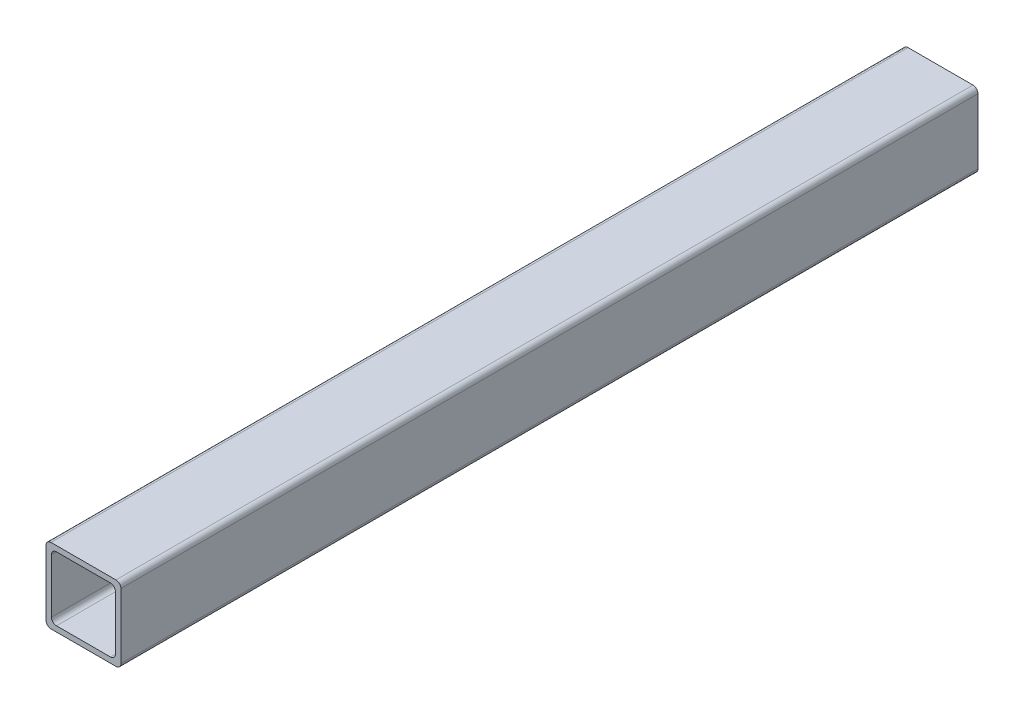
ISO-10303-21;
HEADER;
FILE_DESCRIPTION(('STEP AP214'),'2;1');
FILE_NAME('part.step','',(''),(''),'','','');
FILE_SCHEMA(('AUTOMOTIVE_DESIGN { 1 0 10303 214 1 1 1 1 }'));
ENDSEC;
DATA;
#1=APPLICATION_CONTEXT('core data for automotive mechanical design processes');
#2=APPLICATION_PROTOCOL_DEFINITION('international standard','automotive_design',2000,#1);
#3=PRODUCT_CONTEXT('',#1,'mechanical');
#4=PRODUCT('Part','Part','',(#3));
#5=PRODUCT_RELATED_PRODUCT_CATEGORY('part','',(#4));
#6=PRODUCT_DEFINITION_FORMATION('','',#4);
#7=PRODUCT_DEFINITION_CONTEXT('part definition',#1,'design');
#8=PRODUCT_DEFINITION('design','',#6,#7);
#9=PRODUCT_DEFINITION_SHAPE('','',#8);
#10=(LENGTH_UNIT() NAMED_UNIT(*) SI_UNIT(.MILLI.,.METRE.));
#11=(NAMED_UNIT(*) PLANE_ANGLE_UNIT() SI_UNIT($,.RADIAN.));
#12=(NAMED_UNIT(*) SI_UNIT($,.STERADIAN.) SOLID_ANGLE_UNIT());
#13=UNCERTAINTY_MEASURE_WITH_UNIT(LENGTH_MEASURE(1.E-05),#10,'distance_accuracy_value','');
#14=(GEOMETRIC_REPRESENTATION_CONTEXT(3) GLOBAL_UNCERTAINTY_ASSIGNED_CONTEXT((#13)) GLOBAL_UNIT_ASSIGNED_CONTEXT((#10,
#11,#12)) REPRESENTATION_CONTEXT('',''));
#15=CARTESIAN_POINT('',(0.,0.,0.));
#16=DIRECTION('',(0.,0.,1.));
#17=DIRECTION('',(1.,0.,0.));
#18=AXIS2_PLACEMENT_3D('',#15,#16,#17);
#19=CARTESIAN_POINT('',(2.54,-35.56,435.78));
#20=DIRECTION('',(0.,0.,1.));
#21=DIRECTION('',(1.,0.,0.));
#22=AXIS2_PLACEMENT_3D('',#19,#20,#21);
#23=PLANE('',#22);
#24=CARTESIAN_POINT('',(2.54,-35.56,435.78));
#25=DIRECTION('',(0.,0.,1.));
#26=DIRECTION('',(1.,0.,0.));
#27=AXIS2_PLACEMENT_3D('',#24,#25,#26);
#28=CIRCLE('',#27,2.54);
#29=CARTESIAN_POINT('',(0.,-35.56,435.78));
#30=VERTEX_POINT('',#29);
#31=CARTESIAN_POINT('',(2.54000000000002,-38.1,435.78));
#32=VERTEX_POINT('',#31);
#33=EDGE_CURVE('E212',#30,#32,#28,.T.);
#34=ORIENTED_EDGE('',*,*,#33,.T.);
#35=DIRECTION('',(1.,0.,0.));
#36=VECTOR('',#35,1.);
#37=CARTESIAN_POINT('',(2.54000000000002,-38.1,435.78));
#38=LINE('',#37,#36);
#39=CARTESIAN_POINT('',(35.56,-38.1,435.78));
#40=VERTEX_POINT('',#39);
#41=EDGE_CURVE('E215',#32,#40,#38,.T.);
#42=ORIENTED_EDGE('',*,*,#41,.T.);
#43=CARTESIAN_POINT('',(35.56,-35.56,435.78));
#44=DIRECTION('',(0.,0.,1.));
#45=DIRECTION('',(-1.,0.,0.));
#46=AXIS2_PLACEMENT_3D('',#43,#44,#45);
#47=CIRCLE('',#46,2.54);
#48=CARTESIAN_POINT('',(38.1,-35.56,435.78));
#49=VERTEX_POINT('',#48);
#50=EDGE_CURVE('E218',#40,#49,#47,.T.);
#51=ORIENTED_EDGE('',*,*,#50,.T.);
#52=DIRECTION('',(0.,1.,0.));
#53=VECTOR('',#52,1.);
#54=CARTESIAN_POINT('',(38.1,-2.54000000000002,435.78));
#55=LINE('',#54,#53);
#56=CARTESIAN_POINT('',(38.1,-2.54000000000002,435.78));
#57=VERTEX_POINT('',#56);
#58=EDGE_CURVE('E220',#49,#57,#55,.T.);
#59=ORIENTED_EDGE('',*,*,#58,.T.);
#60=CARTESIAN_POINT('',(35.56,-2.54,435.78));
#61=DIRECTION('',(0.,0.,1.));
#62=DIRECTION('',(1.,0.,0.));
#63=AXIS2_PLACEMENT_3D('',#60,#61,#62);
#64=CIRCLE('',#63,2.54);
#65=CARTESIAN_POINT('',(35.56,0.,435.78));
#66=VERTEX_POINT('',#65);
#67=EDGE_CURVE('E222',#57,#66,#64,.T.);
#68=ORIENTED_EDGE('',*,*,#67,.T.);
#69=DIRECTION('',(-1.,0.,0.));
#70=VECTOR('',#69,1.);
#71=CARTESIAN_POINT('',(2.54000000000002,0.,435.78));
#72=LINE('',#71,#70);
#73=CARTESIAN_POINT('',(2.54000000000002,0.,435.78));
#74=VERTEX_POINT('',#73);
#75=EDGE_CURVE('E224',#66,#74,#72,.T.);
#76=ORIENTED_EDGE('',*,*,#75,.T.);
#77=CARTESIAN_POINT('',(2.54,-2.54,435.78));
#78=DIRECTION('',(0.,0.,1.));
#79=DIRECTION('',(-1.,0.,0.));
#80=AXIS2_PLACEMENT_3D('',#77,#78,#79);
#81=CIRCLE('',#80,2.54);
#82=CARTESIAN_POINT('',(0.,-2.54000000000002,435.78));
#83=VERTEX_POINT('',#82);
#84=EDGE_CURVE('E226',#74,#83,#81,.T.);
#85=ORIENTED_EDGE('',*,*,#84,.T.);
#86=DIRECTION('',(0.,-1.,0.));
#87=VECTOR('',#86,1.);
#88=CARTESIAN_POINT('',(0.,-2.54000000000002,435.78));
#89=LINE('',#88,#87);
#90=EDGE_CURVE('E228',#83,#30,#89,.T.);
#91=ORIENTED_EDGE('',*,*,#90,.T.);
#92=EDGE_LOOP('',(#34,#42,#51,#59,#68,#76,#85,#91));
#93=FACE_BOUND('',#92,.T.);
#94=DIRECTION('',(1.,0.,0.));
#95=VECTOR('',#94,1.);
#96=CARTESIAN_POINT('',(5.30860000000002,-35.3314,435.78));
#97=LINE('',#96,#95);
#98=CARTESIAN_POINT('',(5.30860000000002,-35.3314,435.78));
#99=VERTEX_POINT('',#98);
#100=CARTESIAN_POINT('',(32.7914,-35.3314,435.78));
#101=VERTEX_POINT('',#100);
#102=EDGE_CURVE('E155',#99,#101,#97,.T.);
#103=ORIENTED_EDGE('',*,*,#102,.F.);
#104=CARTESIAN_POINT('',(5.3086,-32.7914,435.78));
#105=DIRECTION('',(0.,0.,1.));
#106=DIRECTION('',(1.,0.,0.));
#107=AXIS2_PLACEMENT_3D('',#104,#105,#106);
#108=CIRCLE('',#107,2.54);
#109=CARTESIAN_POINT('',(2.7686,-32.7914,435.78));
#110=VERTEX_POINT('',#109);
#111=EDGE_CURVE('E147',#110,#99,#108,.T.);
#112=ORIENTED_EDGE('',*,*,#111,.F.);
#113=DIRECTION('',(0.,-1.,0.));
#114=VECTOR('',#113,1.);
#115=CARTESIAN_POINT('',(2.7686,-5.30860000000002,435.78));
#116=LINE('',#115,#114);
#117=CARTESIAN_POINT('',(2.7686,-5.30860000000002,435.78));
#118=VERTEX_POINT('',#117);
#119=EDGE_CURVE('E180',#118,#110,#116,.T.);
#120=ORIENTED_EDGE('',*,*,#119,.F.);
#121=CARTESIAN_POINT('',(5.3086,-5.3086,435.78));
#122=DIRECTION('',(0.,0.,1.));
#123=DIRECTION('',(1.,0.,0.));
#124=AXIS2_PLACEMENT_3D('',#121,#122,#123);
#125=CIRCLE('',#124,2.54);
#126=CARTESIAN_POINT('',(5.30860000000002,-2.7686,435.78));
#127=VERTEX_POINT('',#126);
#128=EDGE_CURVE('E178',#127,#118,#125,.T.);
#129=ORIENTED_EDGE('',*,*,#128,.F.);
#130=DIRECTION('',(-1.,0.,0.));
#131=VECTOR('',#130,1.);
#132=CARTESIAN_POINT('',(5.30860000000002,-2.7686,435.78));
#133=LINE('',#132,#131);
#134=CARTESIAN_POINT('',(32.7914,-2.7686,435.78));
#135=VERTEX_POINT('',#134);
#136=EDGE_CURVE('E176',#135,#127,#133,.T.);
#137=ORIENTED_EDGE('',*,*,#136,.F.);
#138=CARTESIAN_POINT('',(32.7914,-5.3086,435.78));
#139=DIRECTION('',(0.,0.,1.));
#140=DIRECTION('',(1.,0.,0.));
#141=AXIS2_PLACEMENT_3D('',#138,#139,#140);
#142=CIRCLE('',#141,2.54);
#143=CARTESIAN_POINT('',(35.3314,-5.30860000000002,435.78));
#144=VERTEX_POINT('',#143);
#145=EDGE_CURVE('E174',#144,#135,#142,.T.);
#146=ORIENTED_EDGE('',*,*,#145,.F.);
#147=DIRECTION('',(0.,1.,0.));
#148=VECTOR('',#147,1.);
#149=CARTESIAN_POINT('',(35.3314,-5.30860000000002,435.78));
#150=LINE('',#149,#148);
#151=CARTESIAN_POINT('',(35.3314,-32.7914,435.78));
#152=VERTEX_POINT('',#151);
#153=EDGE_CURVE('E170',#152,#144,#150,.T.);
#154=ORIENTED_EDGE('',*,*,#153,.F.);
#155=CARTESIAN_POINT('',(32.7914,-32.7914,435.78));
#156=DIRECTION('',(0.,0.,1.));
#157=DIRECTION('',(1.,0.,0.));
#158=AXIS2_PLACEMENT_3D('',#155,#156,#157);
#159=CIRCLE('',#158,2.54);
#160=EDGE_CURVE('E168',#101,#152,#159,.T.);
#161=ORIENTED_EDGE('',*,*,#160,.F.);
#162=EDGE_LOOP('',(#103,#112,#120,#129,#137,#146,#154,#161));
#163=FACE_BOUND('',#162,.T.);
#164=ADVANCED_FACE('F34',(#93,#163),#23,.T.);
#165=CARTESIAN_POINT('',(2.54,-35.56,0.));
#166=DIRECTION('',(0.,0.,1.));
#167=DIRECTION('',(1.,0.,0.));
#168=AXIS2_PLACEMENT_3D('',#165,#166,#167);
#169=PLANE('',#168);
#170=CARTESIAN_POINT('',(2.54,-35.56,0.));
#171=DIRECTION('',(0.,0.,1.));
#172=DIRECTION('',(1.,0.,0.));
#173=AXIS2_PLACEMENT_3D('',#170,#171,#172);
#174=CIRCLE('',#173,2.54);
#175=CARTESIAN_POINT('',(0.,-35.56,0.));
#176=VERTEX_POINT('',#175);
#177=CARTESIAN_POINT('',(2.54000000000002,-38.1,0.));
#178=VERTEX_POINT('',#177);
#179=EDGE_CURVE('E163',#176,#178,#174,.T.);
#180=ORIENTED_EDGE('',*,*,#179,.F.);
#181=DIRECTION('',(0.,-1.,0.));
#182=VECTOR('',#181,1.);
#183=CARTESIAN_POINT('',(0.,-2.54000000000002,0.));
#184=LINE('',#183,#182);
#185=CARTESIAN_POINT('',(0.,-2.54000000000002,0.));
#186=VERTEX_POINT('',#185);
#187=EDGE_CURVE('E216',#186,#176,#184,.T.);
#188=ORIENTED_EDGE('',*,*,#187,.F.);
#189=CARTESIAN_POINT('',(2.54,-2.54,0.));
#190=DIRECTION('',(0.,0.,1.));
#191=DIRECTION('',(-1.,0.,0.));
#192=AXIS2_PLACEMENT_3D('',#189,#190,#191);
#193=CIRCLE('',#192,2.54);
#194=CARTESIAN_POINT('',(2.54000000000002,0.,0.));
#195=VERTEX_POINT('',#194);
#196=EDGE_CURVE('E243',#195,#186,#193,.T.);
#197=ORIENTED_EDGE('',*,*,#196,.F.);
#198=DIRECTION('',(-1.,0.,0.));
#199=VECTOR('',#198,1.);
#200=CARTESIAN_POINT('',(2.54000000000002,0.,0.));
#201=LINE('',#200,#199);
#202=CARTESIAN_POINT('',(35.56,0.,0.));
#203=VERTEX_POINT('',#202);
#204=EDGE_CURVE('E241',#203,#195,#201,.T.);
#205=ORIENTED_EDGE('',*,*,#204,.F.);
#206=CARTESIAN_POINT('',(35.56,-2.54,0.));
#207=DIRECTION('',(0.,0.,1.));
#208=DIRECTION('',(1.,0.,0.));
#209=AXIS2_PLACEMENT_3D('',#206,#207,#208);
#210=CIRCLE('',#209,2.54);
#211=CARTESIAN_POINT('',(38.1,-2.54000000000002,0.));
#212=VERTEX_POINT('',#211);
#213=EDGE_CURVE('E239',#212,#203,#210,.T.);
#214=ORIENTED_EDGE('',*,*,#213,.F.);
#215=DIRECTION('',(0.,1.,0.));
#216=VECTOR('',#215,1.);
#217=CARTESIAN_POINT('',(38.1,-2.54000000000002,0.));
#218=LINE('',#217,#216);
#219=CARTESIAN_POINT('',(38.1,-35.56,0.));
#220=VERTEX_POINT('',#219);
#221=EDGE_CURVE('E237',#220,#212,#218,.T.);
#222=ORIENTED_EDGE('',*,*,#221,.F.);
#223=CARTESIAN_POINT('',(35.56,-35.56,0.));
#224=DIRECTION('',(0.,0.,1.));
#225=DIRECTION('',(-1.,0.,0.));
#226=AXIS2_PLACEMENT_3D('',#223,#224,#225);
#227=CIRCLE('',#226,2.54);
#228=CARTESIAN_POINT('',(35.56,-38.1,0.));
#229=VERTEX_POINT('',#228);
#230=EDGE_CURVE('E235',#229,#220,#227,.T.);
#231=ORIENTED_EDGE('',*,*,#230,.F.);
#232=DIRECTION('',(1.,0.,0.));
#233=VECTOR('',#232,1.);
#234=CARTESIAN_POINT('',(2.54000000000002,-38.1,0.));
#235=LINE('',#234,#233);
#236=EDGE_CURVE('E233',#178,#229,#235,.T.);
#237=ORIENTED_EDGE('',*,*,#236,.F.);
#238=EDGE_LOOP('',(#180,#188,#197,#205,#214,#222,#231,#237));
#239=FACE_BOUND('',#238,.T.);
#240=CARTESIAN_POINT('',(5.3086,-32.7914,0.));
#241=DIRECTION('',(0.,0.,1.));
#242=DIRECTION('',(1.,0.,0.));
#243=AXIS2_PLACEMENT_3D('',#240,#241,#242);
#244=CIRCLE('',#243,2.54);
#245=CARTESIAN_POINT('',(2.7686,-32.7914,0.));
#246=VERTEX_POINT('',#245);
#247=CARTESIAN_POINT('',(5.30860000000002,-35.3314,0.));
#248=VERTEX_POINT('',#247);
#249=EDGE_CURVE('E57',#246,#248,#244,.T.);
#250=ORIENTED_EDGE('',*,*,#249,.T.);
#251=DIRECTION('',(1.,0.,0.));
#252=VECTOR('',#251,1.);
#253=CARTESIAN_POINT('',(5.30860000000002,-35.3314,0.));
#254=LINE('',#253,#252);
#255=CARTESIAN_POINT('',(32.7914,-35.3314,0.));
#256=VERTEX_POINT('',#255);
#257=EDGE_CURVE('E162',#248,#256,#254,.T.);
#258=ORIENTED_EDGE('',*,*,#257,.T.);
#259=CARTESIAN_POINT('',(32.7914,-32.7914,0.));
#260=DIRECTION('',(0.,0.,1.));
#261=DIRECTION('',(1.,0.,0.));
#262=AXIS2_PLACEMENT_3D('',#259,#260,#261);
#263=CIRCLE('',#262,2.54);
#264=CARTESIAN_POINT('',(35.3314,-32.7914,0.));
#265=VERTEX_POINT('',#264);
#266=EDGE_CURVE('E184',#256,#265,#263,.T.);
#267=ORIENTED_EDGE('',*,*,#266,.T.);
#268=DIRECTION('',(0.,1.,0.));
#269=VECTOR('',#268,1.);
#270=CARTESIAN_POINT('',(35.3314,-5.30860000000002,0.));
#271=LINE('',#270,#269);
#272=CARTESIAN_POINT('',(35.3314,-5.30860000000002,0.));
#273=VERTEX_POINT('',#272);
#274=EDGE_CURVE('E187',#265,#273,#271,.T.);
#275=ORIENTED_EDGE('',*,*,#274,.T.);
#276=CARTESIAN_POINT('',(32.7914,-5.3086,0.));
#277=DIRECTION('',(0.,0.,1.));
#278=DIRECTION('',(1.,0.,0.));
#279=AXIS2_PLACEMENT_3D('',#276,#277,#278);
#280=CIRCLE('',#279,2.54);
#281=CARTESIAN_POINT('',(32.7914,-2.7686,0.));
#282=VERTEX_POINT('',#281);
#283=EDGE_CURVE('E190',#273,#282,#280,.T.);
#284=ORIENTED_EDGE('',*,*,#283,.T.);
#285=DIRECTION('',(-1.,0.,0.));
#286=VECTOR('',#285,1.);
#287=CARTESIAN_POINT('',(5.30860000000002,-2.7686,0.));
#288=LINE('',#287,#286);
#289=CARTESIAN_POINT('',(5.30860000000002,-2.7686,0.));
#290=VERTEX_POINT('',#289);
#291=EDGE_CURVE('E193',#282,#290,#288,.T.);
#292=ORIENTED_EDGE('',*,*,#291,.T.);
#293=CARTESIAN_POINT('',(5.3086,-5.3086,0.));
#294=DIRECTION('',(0.,0.,1.));
#295=DIRECTION('',(1.,0.,0.));
#296=AXIS2_PLACEMENT_3D('',#293,#294,#295);
#297=CIRCLE('',#296,2.54);
#298=CARTESIAN_POINT('',(2.7686,-5.30860000000002,0.));
#299=VERTEX_POINT('',#298);
#300=EDGE_CURVE('E196',#290,#299,#297,.T.);
#301=ORIENTED_EDGE('',*,*,#300,.T.);
#302=DIRECTION('',(0.,-1.,0.));
#303=VECTOR('',#302,1.);
#304=CARTESIAN_POINT('',(2.7686,-5.30860000000002,0.));
#305=LINE('',#304,#303);
#306=EDGE_CURVE('E156',#299,#246,#305,.T.);
#307=ORIENTED_EDGE('',*,*,#306,.T.);
#308=EDGE_LOOP('',(#250,#258,#267,#275,#284,#292,#301,#307));
#309=FACE_BOUND('',#308,.T.);
#310=ADVANCED_FACE('F273',(#239,#309),#169,.F.);
#311=CARTESIAN_POINT('',(2.54,-35.56,435.78));
#312=DIRECTION('',(0.,0.,-1.));
#313=DIRECTION('',(-1.,0.,0.));
#314=AXIS2_PLACEMENT_3D('',#311,#312,#313);
#315=CYLINDRICAL_SURFACE('',#314,2.54);
#316=ORIENTED_EDGE('',*,*,#179,.T.);
#317=DIRECTION('',(0.,0.,-1.));
#318=VECTOR('',#317,1.);
#319=CARTESIAN_POINT('',(2.54000000000002,-38.1,435.78));
#320=LINE('',#319,#318);
#321=EDGE_CURVE('E11',#32,#178,#320,.T.);
#322=ORIENTED_EDGE('',*,*,#321,.F.);
#323=ORIENTED_EDGE('',*,*,#33,.F.);
#324=DIRECTION('',(0.,0.,-1.));
#325=VECTOR('',#324,1.);
#326=CARTESIAN_POINT('',(0.,-35.56,435.78));
#327=LINE('',#326,#325);
#328=EDGE_CURVE('E230',#30,#176,#327,.T.);
#329=ORIENTED_EDGE('',*,*,#328,.T.);
#330=EDGE_LOOP('',(#316,#322,#323,#329));
#331=FACE_BOUND('',#330,.T.);
#332=ADVANCED_FACE('F36',(#331),#315,.T.);
#333=CARTESIAN_POINT('',(2.54000000000002,-38.1,435.78));
#334=DIRECTION('',(0.,1.,0.));
#335=DIRECTION('',(0.,0.,1.));
#336=AXIS2_PLACEMENT_3D('',#333,#334,#335);
#337=PLANE('',#336);
#338=ORIENTED_EDGE('',*,*,#236,.T.);
#339=DIRECTION('',(0.,0.,-1.));
#340=VECTOR('',#339,1.);
#341=CARTESIAN_POINT('',(35.56,-38.1,435.78));
#342=LINE('',#341,#340);
#343=EDGE_CURVE('E42',#40,#229,#342,.T.);
#344=ORIENTED_EDGE('',*,*,#343,.F.);
#345=ORIENTED_EDGE('',*,*,#41,.F.);
#346=ORIENTED_EDGE('',*,*,#321,.T.);
#347=EDGE_LOOP('',(#338,#344,#345,#346));
#348=FACE_BOUND('',#347,.T.);
#349=ADVANCED_FACE('F290',(#348),#337,.F.);
#350=CARTESIAN_POINT('',(35.56,-35.56,435.78));
#351=DIRECTION('',(0.,0.,-1.));
#352=DIRECTION('',(-1.,0.,0.));
#353=AXIS2_PLACEMENT_3D('',#350,#351,#352);
#354=CYLINDRICAL_SURFACE('',#353,2.54);
#355=ORIENTED_EDGE('',*,*,#230,.T.);
#356=DIRECTION('',(0.,0.,-1.));
#357=VECTOR('',#356,1.);
#358=CARTESIAN_POINT('',(38.1,-35.56,435.78));
#359=LINE('',#358,#357);
#360=EDGE_CURVE('E260',#49,#220,#359,.T.);
#361=ORIENTED_EDGE('',*,*,#360,.F.);
#362=ORIENTED_EDGE('',*,*,#50,.F.);
#363=ORIENTED_EDGE('',*,*,#343,.T.);
#364=EDGE_LOOP('',(#355,#361,#362,#363));
#365=FACE_BOUND('',#364,.T.);
#366=ADVANCED_FACE('F267',(#365),#354,.T.);
#367=CARTESIAN_POINT('',(38.1,-2.54000000000002,435.78));
#368=DIRECTION('',(-1.,0.,0.));
#369=DIRECTION('',(0.,-1.,0.));
#370=AXIS2_PLACEMENT_3D('',#367,#368,#369);
#371=PLANE('',#370);
#372=ORIENTED_EDGE('',*,*,#221,.T.);
#373=DIRECTION('',(0.,0.,-1.));
#374=VECTOR('',#373,1.);
#375=CARTESIAN_POINT('',(38.1,-2.54000000000002,435.78));
#376=LINE('',#375,#374);
#377=EDGE_CURVE('E257',#57,#212,#376,.T.);
#378=ORIENTED_EDGE('',*,*,#377,.F.);
#379=ORIENTED_EDGE('',*,*,#58,.F.);
#380=ORIENTED_EDGE('',*,*,#360,.T.);
#381=EDGE_LOOP('',(#372,#378,#379,#380));
#382=FACE_BOUND('',#381,.T.);
#383=ADVANCED_FACE('F279',(#382),#371,.F.);
#384=CARTESIAN_POINT('',(35.56,-2.54,435.78));
#385=DIRECTION('',(0.,0.,-1.));
#386=DIRECTION('',(-1.,0.,0.));
#387=AXIS2_PLACEMENT_3D('',#384,#385,#386);
#388=CYLINDRICAL_SURFACE('',#387,2.54);
#389=ORIENTED_EDGE('',*,*,#213,.T.);
#390=DIRECTION('',(0.,0.,-1.));
#391=VECTOR('',#390,1.);
#392=CARTESIAN_POINT('',(35.56,0.,435.78));
#393=LINE('',#392,#391);
#394=EDGE_CURVE('E254',#66,#203,#393,.T.);
#395=ORIENTED_EDGE('',*,*,#394,.F.);
#396=ORIENTED_EDGE('',*,*,#67,.F.);
#397=ORIENTED_EDGE('',*,*,#377,.T.);
#398=EDGE_LOOP('',(#389,#395,#396,#397));
#399=FACE_BOUND('',#398,.T.);
#400=ADVANCED_FACE('F283',(#399),#388,.T.);
#401=CARTESIAN_POINT('',(2.54000000000002,0.,435.78));
#402=DIRECTION('',(0.,-1.,0.));
#403=DIRECTION('',(0.,0.,-1.));
#404=AXIS2_PLACEMENT_3D('',#401,#402,#403);
#405=PLANE('',#404);
#406=ORIENTED_EDGE('',*,*,#204,.T.);
#407=DIRECTION('',(0.,0.,-1.));
#408=VECTOR('',#407,1.);
#409=CARTESIAN_POINT('',(2.54000000000002,0.,435.78));
#410=LINE('',#409,#408);
#411=EDGE_CURVE('E251',#74,#195,#410,.T.);
#412=ORIENTED_EDGE('',*,*,#411,.F.);
#413=ORIENTED_EDGE('',*,*,#75,.F.);
#414=ORIENTED_EDGE('',*,*,#394,.T.);
#415=EDGE_LOOP('',(#406,#412,#413,#414));
#416=FACE_BOUND('',#415,.T.);
#417=ADVANCED_FACE('F303',(#416),#405,.F.);
#418=CARTESIAN_POINT('',(2.54,-2.54,435.78));
#419=DIRECTION('',(0.,0.,-1.));
#420=DIRECTION('',(-1.,0.,0.));
#421=AXIS2_PLACEMENT_3D('',#418,#419,#420);
#422=CYLINDRICAL_SURFACE('',#421,2.54);
#423=ORIENTED_EDGE('',*,*,#196,.T.);
#424=DIRECTION('',(0.,0.,-1.));
#425=VECTOR('',#424,1.);
#426=CARTESIAN_POINT('',(0.,-2.54000000000002,435.78));
#427=LINE('',#426,#425);
#428=EDGE_CURVE('E248',#83,#186,#427,.T.);
#429=ORIENTED_EDGE('',*,*,#428,.F.);
#430=ORIENTED_EDGE('',*,*,#84,.F.);
#431=ORIENTED_EDGE('',*,*,#411,.T.);
#432=EDGE_LOOP('',(#423,#429,#430,#431));
#433=FACE_BOUND('',#432,.T.);
#434=ADVANCED_FACE('F301',(#433),#422,.T.);
#435=CARTESIAN_POINT('',(0.,-2.54000000000002,435.78));
#436=DIRECTION('',(1.,0.,0.));
#437=DIRECTION('',(0.,1.,0.));
#438=AXIS2_PLACEMENT_3D('',#435,#436,#437);
#439=PLANE('',#438);
#440=ORIENTED_EDGE('',*,*,#187,.T.);
#441=ORIENTED_EDGE('',*,*,#328,.F.);
#442=ORIENTED_EDGE('',*,*,#90,.F.);
#443=ORIENTED_EDGE('',*,*,#428,.T.);
#444=EDGE_LOOP('',(#440,#441,#442,#443));
#445=FACE_BOUND('',#444,.T.);
#446=ADVANCED_FACE('F296',(#445),#439,.F.);
#447=CARTESIAN_POINT('',(5.3086,-32.7914,435.78));
#448=DIRECTION('',(0.,0.,-1.));
#449=DIRECTION('',(-1.,0.,0.));
#450=AXIS2_PLACEMENT_3D('',#447,#448,#449);
#451=CYLINDRICAL_SURFACE('',#450,2.54);
#452=ORIENTED_EDGE('',*,*,#249,.F.);
#453=DIRECTION('',(0.,0.,-1.));
#454=VECTOR('',#453,1.);
#455=CARTESIAN_POINT('',(2.7686,-32.7914,435.78));
#456=LINE('',#455,#454);
#457=EDGE_CURVE('E151',#110,#246,#456,.T.);
#458=ORIENTED_EDGE('',*,*,#457,.F.);
#459=ORIENTED_EDGE('',*,*,#111,.T.);
#460=DIRECTION('',(0.,0.,-1.));
#461=VECTOR('',#460,1.);
#462=CARTESIAN_POINT('',(5.30860000000002,-35.3314,435.78));
#463=LINE('',#462,#461);
#464=EDGE_CURVE('E150',#99,#248,#463,.T.);
#465=ORIENTED_EDGE('',*,*,#464,.T.);
#466=EDGE_LOOP('',(#452,#458,#459,#465));
#467=FACE_BOUND('',#466,.T.);
#468=ADVANCED_FACE('F149',(#467),#451,.F.);
#469=CARTESIAN_POINT('',(5.30860000000002,-35.3314,435.78));
#470=DIRECTION('',(0.,1.,0.));
#471=DIRECTION('',(0.,0.,1.));
#472=AXIS2_PLACEMENT_3D('',#469,#470,#471);
#473=PLANE('',#472);
#474=ORIENTED_EDGE('',*,*,#257,.F.);
#475=ORIENTED_EDGE('',*,*,#464,.F.);
#476=ORIENTED_EDGE('',*,*,#102,.T.);
#477=DIRECTION('',(0.,0.,-1.));
#478=VECTOR('',#477,1.);
#479=CARTESIAN_POINT('',(32.7914,-35.3314,435.78));
#480=LINE('',#479,#478);
#481=EDGE_CURVE('E164',#101,#256,#480,.T.);
#482=ORIENTED_EDGE('',*,*,#481,.T.);
#483=EDGE_LOOP('',(#474,#475,#476,#482));
#484=FACE_BOUND('',#483,.T.);
#485=ADVANCED_FACE('F159',(#484),#473,.T.);
#486=CARTESIAN_POINT('',(32.7914,-32.7914,435.78));
#487=DIRECTION('',(0.,0.,-1.));
#488=DIRECTION('',(-1.,0.,0.));
#489=AXIS2_PLACEMENT_3D('',#486,#487,#488);
#490=CYLINDRICAL_SURFACE('',#489,2.54);
#491=ORIENTED_EDGE('',*,*,#266,.F.);
#492=ORIENTED_EDGE('',*,*,#481,.F.);
#493=ORIENTED_EDGE('',*,*,#160,.T.);
#494=DIRECTION('',(0.,0.,-1.));
#495=VECTOR('',#494,1.);
#496=CARTESIAN_POINT('',(35.3314,-32.7914,435.78));
#497=LINE('',#496,#495);
#498=EDGE_CURVE('E209',#152,#265,#497,.T.);
#499=ORIENTED_EDGE('',*,*,#498,.T.);
#500=EDGE_LOOP('',(#491,#492,#493,#499));
#501=FACE_BOUND('',#500,.T.);
#502=ADVANCED_FACE('F328',(#501),#490,.F.);
#503=CARTESIAN_POINT('',(35.3314,-5.30860000000002,435.78));
#504=DIRECTION('',(-1.,0.,0.));
#505=DIRECTION('',(0.,0.,1.));
#506=AXIS2_PLACEMENT_3D('',#503,#504,#505);
#507=PLANE('',#506);
#508=ORIENTED_EDGE('',*,*,#274,.F.);
#509=ORIENTED_EDGE('',*,*,#498,.F.);
#510=ORIENTED_EDGE('',*,*,#153,.T.);
#511=DIRECTION('',(0.,0.,-1.));
#512=VECTOR('',#511,1.);
#513=CARTESIAN_POINT('',(35.3314,-5.30860000000002,435.78));
#514=LINE('',#513,#512);
#515=EDGE_CURVE('E207',#144,#273,#514,.T.);
#516=ORIENTED_EDGE('',*,*,#515,.T.);
#517=EDGE_LOOP('',(#508,#509,#510,#516));
#518=FACE_BOUND('',#517,.T.);
#519=ADVANCED_FACE('F332',(#518),#507,.T.);
#520=CARTESIAN_POINT('',(32.7914,-5.3086,435.78));
#521=DIRECTION('',(0.,0.,-1.));
#522=DIRECTION('',(-1.,0.,0.));
#523=AXIS2_PLACEMENT_3D('',#520,#521,#522);
#524=CYLINDRICAL_SURFACE('',#523,2.54);
#525=ORIENTED_EDGE('',*,*,#283,.F.);
#526=ORIENTED_EDGE('',*,*,#515,.F.);
#527=ORIENTED_EDGE('',*,*,#145,.T.);
#528=DIRECTION('',(0.,0.,-1.));
#529=VECTOR('',#528,1.);
#530=CARTESIAN_POINT('',(32.7914,-2.7686,435.78));
#531=LINE('',#530,#529);
#532=EDGE_CURVE('E205',#135,#282,#531,.T.);
#533=ORIENTED_EDGE('',*,*,#532,.T.);
#534=EDGE_LOOP('',(#525,#526,#527,#533));
#535=FACE_BOUND('',#534,.T.);
#536=ADVANCED_FACE('F338',(#535),#524,.F.);
#537=CARTESIAN_POINT('',(5.30860000000002,-2.7686,435.78));
#538=DIRECTION('',(0.,-1.,0.));
#539=DIRECTION('',(0.,0.,-1.));
#540=AXIS2_PLACEMENT_3D('',#537,#538,#539);
#541=PLANE('',#540);
#542=ORIENTED_EDGE('',*,*,#291,.F.);
#543=ORIENTED_EDGE('',*,*,#532,.F.);
#544=ORIENTED_EDGE('',*,*,#136,.T.);
#545=DIRECTION('',(0.,0.,-1.));
#546=VECTOR('',#545,1.);
#547=CARTESIAN_POINT('',(5.30860000000002,-2.7686,435.78));
#548=LINE('',#547,#546);
#549=EDGE_CURVE('E203',#127,#290,#548,.T.);
#550=ORIENTED_EDGE('',*,*,#549,.T.);
#551=EDGE_LOOP('',(#542,#543,#544,#550));
#552=FACE_BOUND('',#551,.T.);
#553=ADVANCED_FACE('F342',(#552),#541,.T.);
#554=CARTESIAN_POINT('',(5.3086,-5.3086,435.78));
#555=DIRECTION('',(0.,0.,-1.));
#556=DIRECTION('',(-1.,0.,0.));
#557=AXIS2_PLACEMENT_3D('',#554,#555,#556);
#558=CYLINDRICAL_SURFACE('',#557,2.54);
#559=ORIENTED_EDGE('',*,*,#300,.F.);
#560=ORIENTED_EDGE('',*,*,#549,.F.);
#561=ORIENTED_EDGE('',*,*,#128,.T.);
#562=DIRECTION('',(0.,0.,-1.));
#563=VECTOR('',#562,1.);
#564=CARTESIAN_POINT('',(2.7686,-5.30860000000002,435.78));
#565=LINE('',#564,#563);
#566=EDGE_CURVE('E49',#118,#299,#565,.T.);
#567=ORIENTED_EDGE('',*,*,#566,.T.);
#568=EDGE_LOOP('',(#559,#560,#561,#567));
#569=FACE_BOUND('',#568,.T.);
#570=ADVANCED_FACE('F346',(#569),#558,.F.);
#571=CARTESIAN_POINT('',(2.7686,-5.30860000000002,435.78));
#572=DIRECTION('',(1.,0.,0.));
#573=DIRECTION('',(0.,0.,-1.));
#574=AXIS2_PLACEMENT_3D('',#571,#572,#573);
#575=PLANE('',#574);
#576=ORIENTED_EDGE('',*,*,#306,.F.);
#577=ORIENTED_EDGE('',*,*,#566,.F.);
#578=ORIENTED_EDGE('',*,*,#119,.T.);
#579=ORIENTED_EDGE('',*,*,#457,.T.);
#580=EDGE_LOOP('',(#576,#577,#578,#579));
#581=FACE_BOUND('',#580,.T.);
#582=ADVANCED_FACE('F350',(#581),#575,.T.);
#583=CLOSED_SHELL('',(#164,#310,#332,#349,#366,#383,#400,#417,#434,#446,#468,#485,#502,#519,
#536,#553,#570,#582));
#584=MANIFOLD_SOLID_BREP('B2',#583);
#585=ADVANCED_BREP_SHAPE_REPRESENTATION('',(#18,#584),#14);
#586=SHAPE_DEFINITION_REPRESENTATION(#9,#585);
ENDSEC;
END-ISO-10303-21;
